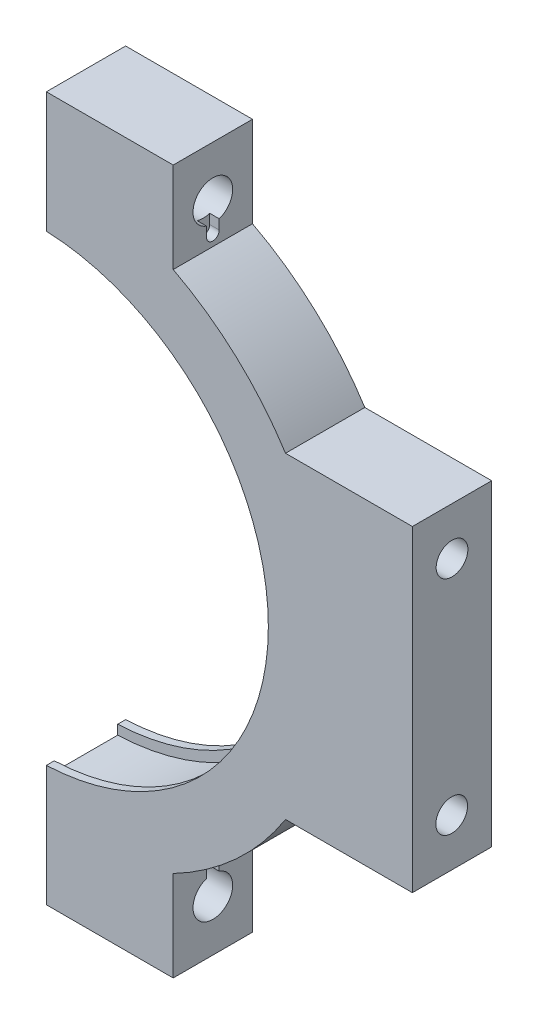
ISO-10303-21;
HEADER;
FILE_DESCRIPTION(('STEP AP214'),'2;1');
FILE_NAME('part.step','',(''),(''),'','','');
FILE_SCHEMA(('AUTOMOTIVE_DESIGN { 1 0 10303 214 1 1 1 1 }'));
ENDSEC;
DATA;
#1=APPLICATION_CONTEXT('core data for automotive mechanical design processes');
#2=APPLICATION_PROTOCOL_DEFINITION('international standard','automotive_design',2000,#1);
#3=PRODUCT_CONTEXT('',#1,'mechanical');
#4=PRODUCT('Part','Part','',(#3));
#5=PRODUCT_RELATED_PRODUCT_CATEGORY('part','',(#4));
#6=PRODUCT_DEFINITION_FORMATION('','',#4);
#7=PRODUCT_DEFINITION_CONTEXT('part definition',#1,'design');
#8=PRODUCT_DEFINITION('design','',#6,#7);
#9=PRODUCT_DEFINITION_SHAPE('','',#8);
#10=(LENGTH_UNIT() NAMED_UNIT(*) SI_UNIT(.MILLI.,.METRE.));
#11=(NAMED_UNIT(*) PLANE_ANGLE_UNIT() SI_UNIT($,.RADIAN.));
#12=(NAMED_UNIT(*) SI_UNIT($,.STERADIAN.) SOLID_ANGLE_UNIT());
#13=UNCERTAINTY_MEASURE_WITH_UNIT(LENGTH_MEASURE(1.E-05),#10,'distance_accuracy_value','');
#14=(GEOMETRIC_REPRESENTATION_CONTEXT(3) GLOBAL_UNCERTAINTY_ASSIGNED_CONTEXT((#13)) GLOBAL_UNIT_ASSIGNED_CONTEXT((#10,
#11,#12)) REPRESENTATION_CONTEXT('',''));
#15=CARTESIAN_POINT('',(0.,0.,0.));
#16=DIRECTION('',(0.,0.,1.));
#17=DIRECTION('',(1.,0.,0.));
#18=AXIS2_PLACEMENT_3D('',#15,#16,#17);
#19=CARTESIAN_POINT('',(0.,0.,25.));
#20=DIRECTION('',(0.,0.,-1.));
#21=DIRECTION('',(-1.,0.,0.));
#22=AXIS2_PLACEMENT_3D('',#19,#20,#21);
#23=CYLINDRICAL_SURFACE('',#22,73.);
#24=DIRECTION('',(0.,0.,-1.));
#25=VECTOR('',#24,1.);
#26=CARTESIAN_POINT('',(3.00000000000001,-72.9383301152419,25.));
#27=LINE('',#26,#25);
#28=CARTESIAN_POINT('',(3.00000000000001,-72.9383301152419,2.5));
#29=VERTEX_POINT('',#28);
#30=CARTESIAN_POINT('',(3.00000000000001,-72.9383301152419,0.));
#31=VERTEX_POINT('',#30);
#32=EDGE_CURVE('E476',#29,#31,#27,.T.);
#33=ORIENTED_EDGE('',*,*,#32,.F.);
#34=CARTESIAN_POINT('',(0.,0.,2.5));
#35=DIRECTION('',(0.,0.,1.));
#36=DIRECTION('',(1.,0.,0.));
#37=AXIS2_PLACEMENT_3D('',#34,#35,#36);
#38=CIRCLE('',#37,73.);
#39=CARTESIAN_POINT('',(2.99999999999999,72.9383301152419,2.5));
#40=VERTEX_POINT('',#39);
#41=EDGE_CURVE('E61',#29,#40,#38,.T.);
#42=ORIENTED_EDGE('',*,*,#41,.T.);
#43=DIRECTION('',(0.,0.,-1.));
#44=VECTOR('',#43,1.);
#45=CARTESIAN_POINT('',(2.99999999999999,72.9383301152419,25.));
#46=LINE('',#45,#44);
#47=CARTESIAN_POINT('',(2.99999999999999,72.9383301152419,0.));
#48=VERTEX_POINT('',#47);
#49=EDGE_CURVE('E479',#40,#48,#46,.T.);
#50=ORIENTED_EDGE('',*,*,#49,.T.);
#51=CARTESIAN_POINT('',(0.,0.,0.));
#52=DIRECTION('',(0.,0.,1.));
#53=DIRECTION('',(1.,0.,0.));
#54=AXIS2_PLACEMENT_3D('',#51,#52,#53);
#55=CIRCLE('',#54,73.);
#56=EDGE_CURVE('E432',#31,#48,#55,.T.);
#57=ORIENTED_EDGE('',*,*,#56,.F.);
#58=EDGE_LOOP('',(#33,#42,#50,#57));
#59=FACE_BOUND('',#58,.T.);
#60=ADVANCED_FACE('F45',(#59),#23,.F.);
#61=CARTESIAN_POINT('',(43.,0.,25.));
#62=DIRECTION('',(1.,0.,0.));
#63=DIRECTION('',(0.,1.,0.));
#64=AXIS2_PLACEMENT_3D('',#61,#62,#63);
#65=PLANE('',#64);
#66=DIRECTION('',(0.,-1.,0.));
#67=VECTOR('',#66,1.);
#68=CARTESIAN_POINT('',(43.,0.,0.));
#69=LINE('',#68,#67);
#70=CARTESIAN_POINT('',(43.,111.,0.));
#71=VERTEX_POINT('',#70);
#72=CARTESIAN_POINT('',(43.,82.4621125123532,0.));
#73=VERTEX_POINT('',#72);
#74=EDGE_CURVE('E420',#71,#73,#69,.T.);
#75=ORIENTED_EDGE('',*,*,#74,.F.);
#76=DIRECTION('',(0.,0.,-1.));
#77=VECTOR('',#76,1.);
#78=CARTESIAN_POINT('',(43.,111.,25.));
#79=LINE('',#78,#77);
#80=CARTESIAN_POINT('',(43.,111.,25.));
#81=VERTEX_POINT('',#80);
#82=EDGE_CURVE('E487',#81,#71,#79,.T.);
#83=ORIENTED_EDGE('',*,*,#82,.F.);
#84=DIRECTION('',(0.,-1.,0.));
#85=VECTOR('',#84,1.);
#86=CARTESIAN_POINT('',(43.,0.,25.));
#87=LINE('',#86,#85);
#88=CARTESIAN_POINT('',(43.,82.4621125123532,25.));
#89=VERTEX_POINT('',#88);
#90=EDGE_CURVE('E377',#81,#89,#87,.T.);
#91=ORIENTED_EDGE('',*,*,#90,.T.);
#92=DIRECTION('',(0.,0.,-1.));
#93=VECTOR('',#92,1.);
#94=CARTESIAN_POINT('',(43.,82.4621125123532,25.));
#95=LINE('',#94,#93);
#96=EDGE_CURVE('E54',#89,#73,#95,.T.);
#97=ORIENTED_EDGE('',*,*,#96,.T.);
#98=EDGE_LOOP('',(#75,#83,#91,#97));
#99=FACE_BOUND('',#98,.T.);
#100=CARTESIAN_POINT('',(43.0000000000001,86.,12.5));
#101=DIRECTION('',(1.,0.,0.));
#102=DIRECTION('',(0.,1.,0.));
#103=AXIS2_PLACEMENT_3D('',#100,#101,#102);
#104=CIRCLE('',#103,2.);
#105=CARTESIAN_POINT('',(43.0000000000001,86.,14.5));
#106=VERTEX_POINT('',#105);
#107=CARTESIAN_POINT('',(43.0000000000001,86.,10.5));
#108=VERTEX_POINT('',#107);
#109=EDGE_CURVE('E282',#106,#108,#104,.T.);
#110=ORIENTED_EDGE('',*,*,#109,.F.);
#111=DIRECTION('',(0.,1.,0.));
#112=VECTOR('',#111,1.);
#113=CARTESIAN_POINT('',(43.,0.,14.5));
#114=LINE('',#113,#112);
#115=CARTESIAN_POINT('',(43.0000000000001,89.0786403588365,14.5));
#116=VERTEX_POINT('',#115);
#117=EDGE_CURVE('E278',#106,#116,#114,.T.);
#118=ORIENTED_EDGE('',*,*,#117,.T.);
#119=CARTESIAN_POINT('',(43.0000000000001,95.,12.5));
#120=DIRECTION('',(1.,0.,0.));
#121=DIRECTION('',(0.,1.,0.));
#122=AXIS2_PLACEMENT_3D('',#119,#120,#121);
#123=CIRCLE('',#122,6.25000000000001);
#124=CARTESIAN_POINT('',(43.0000000000001,89.0786403588365,10.5));
#125=VERTEX_POINT('',#124);
#126=EDGE_CURVE('E342',#125,#116,#123,.T.);
#127=ORIENTED_EDGE('',*,*,#126,.F.);
#128=DIRECTION('',(0.,1.,0.));
#129=VECTOR('',#128,1.);
#130=CARTESIAN_POINT('',(43.,0.,10.5));
#131=LINE('',#130,#129);
#132=EDGE_CURVE('E266',#108,#125,#131,.T.);
#133=ORIENTED_EDGE('',*,*,#132,.F.);
#134=EDGE_LOOP('',(#110,#118,#127,#133));
#135=FACE_BOUND('',#134,.T.);
#136=ADVANCED_FACE('F493',(#99,#135),#65,.T.);
#137=CARTESIAN_POINT('',(43.,0.,25.));
#138=DIRECTION('',(-1.,0.,0.));
#139=DIRECTION('',(0.,0.,1.));
#140=AXIS2_PLACEMENT_3D('',#137,#138,#139);
#141=PLANE('',#140);
#142=DIRECTION('',(0.,1.,0.));
#143=VECTOR('',#142,1.);
#144=CARTESIAN_POINT('',(43.,0.,0.));
#145=LINE('',#144,#143);
#146=CARTESIAN_POINT('',(43.,-111.,0.));
#147=VERTEX_POINT('',#146);
#148=CARTESIAN_POINT('',(43.,-82.4621125123532,0.));
#149=VERTEX_POINT('',#148);
#150=EDGE_CURVE('E442',#147,#149,#145,.T.);
#151=ORIENTED_EDGE('',*,*,#150,.T.);
#152=DIRECTION('',(0.,0.,-1.));
#153=VECTOR('',#152,1.);
#154=CARTESIAN_POINT('',(43.,-82.4621125123532,25.));
#155=LINE('',#154,#153);
#156=CARTESIAN_POINT('',(43.,-82.4621125123532,25.));
#157=VERTEX_POINT('',#156);
#158=EDGE_CURVE('E464',#157,#149,#155,.T.);
#159=ORIENTED_EDGE('',*,*,#158,.F.);
#160=DIRECTION('',(0.,1.,0.));
#161=VECTOR('',#160,1.);
#162=CARTESIAN_POINT('',(43.,0.,25.));
#163=LINE('',#162,#161);
#164=CARTESIAN_POINT('',(43.,-111.,25.));
#165=VERTEX_POINT('',#164);
#166=EDGE_CURVE('E399',#165,#157,#163,.T.);
#167=ORIENTED_EDGE('',*,*,#166,.F.);
#168=DIRECTION('',(0.,0.,-1.));
#169=VECTOR('',#168,1.);
#170=CARTESIAN_POINT('',(43.,-111.,25.));
#171=LINE('',#170,#169);
#172=EDGE_CURVE('E468',#165,#147,#171,.T.);
#173=ORIENTED_EDGE('',*,*,#172,.T.);
#174=EDGE_LOOP('',(#151,#159,#167,#173));
#175=FACE_BOUND('',#174,.T.);
#176=DIRECTION('',(0.,-1.,0.));
#177=VECTOR('',#176,1.);
#178=CARTESIAN_POINT('',(43.,0.,10.5));
#179=LINE('',#178,#177);
#180=CARTESIAN_POINT('',(43.,-86.,10.5));
#181=VERTEX_POINT('',#180);
#182=CARTESIAN_POINT('',(43.,-89.0786403588365,10.5));
#183=VERTEX_POINT('',#182);
#184=EDGE_CURVE('E306',#181,#183,#179,.T.);
#185=ORIENTED_EDGE('',*,*,#184,.T.);
#186=CARTESIAN_POINT('',(43.,-95.,12.5));
#187=DIRECTION('',(1.,0.,0.));
#188=DIRECTION('',(0.,1.,0.));
#189=AXIS2_PLACEMENT_3D('',#186,#187,#188);
#190=CIRCLE('',#189,6.25000000000001);
#191=CARTESIAN_POINT('',(43.,-89.0786403588365,14.5));
#192=VERTEX_POINT('',#191);
#193=EDGE_CURVE('E292',#183,#192,#190,.F.);
#194=ORIENTED_EDGE('',*,*,#193,.T.);
#195=DIRECTION('',(0.,-1.,0.));
#196=VECTOR('',#195,1.);
#197=CARTESIAN_POINT('',(43.,0.,14.5));
#198=LINE('',#197,#196);
#199=CARTESIAN_POINT('',(43.,-86.,14.5));
#200=VERTEX_POINT('',#199);
#201=EDGE_CURVE('E319',#200,#192,#198,.T.);
#202=ORIENTED_EDGE('',*,*,#201,.F.);
#203=CARTESIAN_POINT('',(43.,-86.,12.5));
#204=DIRECTION('',(1.,0.,0.));
#205=DIRECTION('',(0.,1.,0.));
#206=AXIS2_PLACEMENT_3D('',#203,#204,#205);
#207=CIRCLE('',#206,2.);
#208=EDGE_CURVE('E233',#200,#181,#207,.F.);
#209=ORIENTED_EDGE('',*,*,#208,.T.);
#210=EDGE_LOOP('',(#185,#194,#202,#209));
#211=FACE_BOUND('',#210,.T.);
#212=ADVANCED_FACE('F532',(#175,#211),#141,.F.);
#213=CARTESIAN_POINT('',(2.99999999999988,-95.,12.5));
#214=DIRECTION('',(1.,0.,0.));
#215=DIRECTION('',(0.,1.,0.));
#216=AXIS2_PLACEMENT_3D('',#213,#214,#215);
#217=CYLINDRICAL_SURFACE('',#216,6.25000000000001);
#218=CARTESIAN_POINT('',(2.99999999999988,-95.,12.5));
#219=DIRECTION('',(1.,0.,0.));
#220=DIRECTION('',(0.,1.,0.));
#221=AXIS2_PLACEMENT_3D('',#218,#219,#220);
#222=CIRCLE('',#221,6.25000000000001);
#223=CARTESIAN_POINT('',(2.99999999999989,-88.75,12.5));
#224=VERTEX_POINT('',#223);
#225=EDGE_CURVE('E346',#224,#224,#222,.F.);
#226=ORIENTED_EDGE('',*,*,#225,.T.);
#227=EDGE_LOOP('',(#226));
#228=FACE_BOUND('',#227,.T.);
#229=ORIENTED_EDGE('',*,*,#193,.F.);
#230=DIRECTION('',(1.,0.,0.));
#231=VECTOR('',#230,1.);
#232=CARTESIAN_POINT('',(40.,-89.0786403588365,10.5));
#233=LINE('',#232,#231);
#234=CARTESIAN_POINT('',(40.,-89.0786403588365,10.5));
#235=VERTEX_POINT('',#234);
#236=EDGE_CURVE('E328',#235,#183,#233,.T.);
#237=ORIENTED_EDGE('',*,*,#236,.F.);
#238=CARTESIAN_POINT('',(40.,-95.,12.5));
#239=DIRECTION('',(1.,0.,0.));
#240=DIRECTION('',(0.,1.,0.));
#241=AXIS2_PLACEMENT_3D('',#238,#239,#240);
#242=CIRCLE('',#241,6.25000000000001);
#243=CARTESIAN_POINT('',(40.,-89.0786403588365,14.5));
#244=VERTEX_POINT('',#243);
#245=EDGE_CURVE('E309',#244,#235,#242,.F.);
#246=ORIENTED_EDGE('',*,*,#245,.F.);
#247=DIRECTION('',(1.,0.,0.));
#248=VECTOR('',#247,1.);
#249=CARTESIAN_POINT('',(40.,-89.0786403588365,14.5));
#250=LINE('',#249,#248);
#251=EDGE_CURVE('E331',#244,#192,#250,.T.);
#252=ORIENTED_EDGE('',*,*,#251,.T.);
#253=EDGE_LOOP('',(#229,#237,#246,#252));
#254=FACE_BOUND('',#253,.T.);
#255=ADVANCED_FACE('F586',(#228,#254),#217,.F.);
#256=CARTESIAN_POINT('',(2.99999999999998,95.,12.5));
#257=DIRECTION('',(1.,0.,0.));
#258=DIRECTION('',(0.,1.,0.));
#259=AXIS2_PLACEMENT_3D('',#256,#257,#258);
#260=CYLINDRICAL_SURFACE('',#259,6.25000000000001);
#261=CARTESIAN_POINT('',(2.99999999999998,95.,12.5));
#262=DIRECTION('',(1.,0.,0.));
#263=DIRECTION('',(0.,1.,0.));
#264=AXIS2_PLACEMENT_3D('',#261,#262,#263);
#265=CIRCLE('',#264,6.25000000000001);
#266=CARTESIAN_POINT('',(2.99999999999998,101.25,12.5));
#267=VERTEX_POINT('',#266);
#268=EDGE_CURVE('E337',#267,#267,#265,.T.);
#269=ORIENTED_EDGE('',*,*,#268,.F.);
#270=EDGE_LOOP('',(#269));
#271=FACE_BOUND('',#270,.T.);
#272=DIRECTION('',(1.,0.,0.));
#273=VECTOR('',#272,1.);
#274=CARTESIAN_POINT('',(40.0000000000001,89.0786403588365,14.5));
#275=LINE('',#274,#273);
#276=CARTESIAN_POINT('',(40.0000000000001,89.0786403588365,14.5));
#277=VERTEX_POINT('',#276);
#278=EDGE_CURVE('E289',#277,#116,#275,.T.);
#279=ORIENTED_EDGE('',*,*,#278,.F.);
#280=CARTESIAN_POINT('',(40.0000000000001,95.,12.5));
#281=DIRECTION('',(1.,0.,0.));
#282=DIRECTION('',(0.,1.,0.));
#283=AXIS2_PLACEMENT_3D('',#280,#281,#282);
#284=CIRCLE('',#283,6.25000000000001);
#285=CARTESIAN_POINT('',(40.0000000000001,89.0786403588365,10.5));
#286=VERTEX_POINT('',#285);
#287=EDGE_CURVE('E273',#277,#286,#284,.T.);
#288=ORIENTED_EDGE('',*,*,#287,.T.);
#289=DIRECTION('',(1.,0.,0.));
#290=VECTOR('',#289,1.);
#291=CARTESIAN_POINT('',(40.0000000000001,89.0786403588365,10.5));
#292=LINE('',#291,#290);
#293=EDGE_CURVE('E293',#286,#125,#292,.T.);
#294=ORIENTED_EDGE('',*,*,#293,.T.);
#295=ORIENTED_EDGE('',*,*,#126,.T.);
#296=EDGE_LOOP('',(#279,#288,#294,#295));
#297=FACE_BOUND('',#296,.T.);
#298=ADVANCED_FACE('F582',(#271,#297),#260,.F.);
#299=CARTESIAN_POINT('',(0.,50.,25.));
#300=DIRECTION('',(0.,1.,0.));
#301=DIRECTION('',(-1.,0.,0.));
#302=AXIS2_PLACEMENT_3D('',#299,#300,#301);
#303=PLANE('',#302);
#304=DIRECTION('',(1.,0.,0.));
#305=VECTOR('',#304,1.);
#306=CARTESIAN_POINT('',(0.,50.,0.));
#307=LINE('',#306,#305);
#308=CARTESIAN_POINT('',(78.4155596804614,50.,0.));
#309=VERTEX_POINT('',#308);
#310=CARTESIAN_POINT('',(118.415559680461,50.,0.));
#311=VERTEX_POINT('',#310);
#312=EDGE_CURVE('E368',#309,#311,#307,.T.);
#313=ORIENTED_EDGE('',*,*,#312,.F.);
#314=DIRECTION('',(0.,0.,-1.));
#315=VECTOR('',#314,1.);
#316=CARTESIAN_POINT('',(78.4155596804614,50.,25.));
#317=LINE('',#316,#315);
#318=CARTESIAN_POINT('',(78.4155596804614,50.,25.));
#319=VERTEX_POINT('',#318);
#320=EDGE_CURVE('E11',#319,#309,#317,.T.);
#321=ORIENTED_EDGE('',*,*,#320,.F.);
#322=DIRECTION('',(1.,0.,0.));
#323=VECTOR('',#322,1.);
#324=CARTESIAN_POINT('',(0.,50.,25.));
#325=LINE('',#324,#323);
#326=CARTESIAN_POINT('',(118.415559680461,50.,25.));
#327=VERTEX_POINT('',#326);
#328=EDGE_CURVE('E369',#319,#327,#325,.T.);
#329=ORIENTED_EDGE('',*,*,#328,.T.);
#330=DIRECTION('',(0.,0.,-1.));
#331=VECTOR('',#330,1.);
#332=CARTESIAN_POINT('',(118.415559680461,50.,25.));
#333=LINE('',#332,#331);
#334=EDGE_CURVE('E412',#327,#311,#333,.T.);
#335=ORIENTED_EDGE('',*,*,#334,.T.);
#336=EDGE_LOOP('',(#313,#321,#329,#335));
#337=FACE_BOUND('',#336,.T.);
#338=ADVANCED_FACE('F47',(#337),#303,.T.);
#339=CARTESIAN_POINT('',(0.,0.,25.));
#340=DIRECTION('',(0.,0.,-1.));
#341=DIRECTION('',(-1.,0.,0.));
#342=AXIS2_PLACEMENT_3D('',#339,#340,#341);
#343=CYLINDRICAL_SURFACE('',#342,93.);
#344=CARTESIAN_POINT('',(0.,0.,0.));
#345=DIRECTION('',(0.,0.,1.));
#346=DIRECTION('',(1.,0.,0.));
#347=AXIS2_PLACEMENT_3D('',#344,#345,#346);
#348=CIRCLE('',#347,93.);
#349=EDGE_CURVE('E416',#309,#73,#348,.T.);
#350=ORIENTED_EDGE('',*,*,#349,.T.);
#351=ORIENTED_EDGE('',*,*,#96,.F.);
#352=CARTESIAN_POINT('',(0.,0.,25.));
#353=DIRECTION('',(0.,0.,1.));
#354=DIRECTION('',(1.,0.,0.));
#355=AXIS2_PLACEMENT_3D('',#352,#353,#354);
#356=CIRCLE('',#355,93.);
#357=EDGE_CURVE('E373',#319,#89,#356,.T.);
#358=ORIENTED_EDGE('',*,*,#357,.F.);
#359=ORIENTED_EDGE('',*,*,#320,.T.);
#360=EDGE_LOOP('',(#350,#351,#358,#359));
#361=FACE_BOUND('',#360,.T.);
#362=ADVANCED_FACE('F499',(#361),#343,.T.);
#363=CARTESIAN_POINT('',(0.,111.,25.));
#364=DIRECTION('',(0.,1.,0.));
#365=DIRECTION('',(-1.,0.,0.));
#366=AXIS2_PLACEMENT_3D('',#363,#364,#365);
#367=PLANE('',#366);
#368=DIRECTION('',(1.,0.,0.));
#369=VECTOR('',#368,1.);
#370=CARTESIAN_POINT('',(0.,111.,0.));
#371=LINE('',#370,#369);
#372=CARTESIAN_POINT('',(2.99999999999999,111.,0.));
#373=VERTEX_POINT('',#372);
#374=EDGE_CURVE('E424',#373,#71,#371,.T.);
#375=ORIENTED_EDGE('',*,*,#374,.F.);
#376=DIRECTION('',(0.,0.,-1.));
#377=VECTOR('',#376,1.);
#378=CARTESIAN_POINT('',(2.99999999999999,111.,25.));
#379=LINE('',#378,#377);
#380=CARTESIAN_POINT('',(2.99999999999999,111.,25.));
#381=VERTEX_POINT('',#380);
#382=EDGE_CURVE('E484',#381,#373,#379,.T.);
#383=ORIENTED_EDGE('',*,*,#382,.F.);
#384=DIRECTION('',(1.,0.,0.));
#385=VECTOR('',#384,1.);
#386=CARTESIAN_POINT('',(0.,111.,25.));
#387=LINE('',#386,#385);
#388=EDGE_CURVE('E381',#381,#81,#387,.T.);
#389=ORIENTED_EDGE('',*,*,#388,.T.);
#390=ORIENTED_EDGE('',*,*,#82,.T.);
#391=EDGE_LOOP('',(#375,#383,#389,#390));
#392=FACE_BOUND('',#391,.T.);
#393=ADVANCED_FACE('F506',(#392),#367,.T.);
#394=CARTESIAN_POINT('',(3.,0.,25.));
#395=DIRECTION('',(-1.,0.,0.));
#396=DIRECTION('',(0.,-1.,0.));
#397=AXIS2_PLACEMENT_3D('',#394,#395,#396);
#398=PLANE('',#397);
#399=DIRECTION('',(0.,1.,0.));
#400=VECTOR('',#399,1.);
#401=CARTESIAN_POINT('',(3.,0.,22.5));
#402=LINE('',#401,#400);
#403=CARTESIAN_POINT('',(2.99999999999999,72.9383301152419,22.5));
#404=VERTEX_POINT('',#403);
#405=CARTESIAN_POINT('',(2.99999999999999,75.9407663906548,22.5));
#406=VERTEX_POINT('',#405);
#407=EDGE_CURVE('E221',#404,#406,#402,.T.);
#408=ORIENTED_EDGE('',*,*,#407,.F.);
#409=CARTESIAN_POINT('',(2.99999999999999,72.9383301152419,25.));
#410=VERTEX_POINT('',#409);
#411=EDGE_CURVE('E480',#410,#404,#46,.T.);
#412=ORIENTED_EDGE('',*,*,#411,.F.);
#413=DIRECTION('',(0.,1.,0.));
#414=VECTOR('',#413,1.);
#415=CARTESIAN_POINT('',(3.,0.,25.));
#416=LINE('',#415,#414);
#417=EDGE_CURVE('E385',#410,#381,#416,.T.);
#418=ORIENTED_EDGE('',*,*,#417,.T.);
#419=ORIENTED_EDGE('',*,*,#382,.T.);
#420=DIRECTION('',(0.,1.,0.));
#421=VECTOR('',#420,1.);
#422=CARTESIAN_POINT('',(3.,0.,0.));
#423=LINE('',#422,#421);
#424=EDGE_CURVE('E428',#48,#373,#423,.T.);
#425=ORIENTED_EDGE('',*,*,#424,.F.);
#426=ORIENTED_EDGE('',*,*,#49,.F.);
#427=DIRECTION('',(0.,1.,0.));
#428=VECTOR('',#427,1.);
#429=CARTESIAN_POINT('',(3.,0.,2.5));
#430=LINE('',#429,#428);
#431=CARTESIAN_POINT('',(2.99999999999999,75.9407663906548,2.5));
#432=VERTEX_POINT('',#431);
#433=EDGE_CURVE('E243',#40,#432,#430,.T.);
#434=ORIENTED_EDGE('',*,*,#433,.T.);
#435=DIRECTION('',(0.,0.,-1.));
#436=VECTOR('',#435,1.);
#437=CARTESIAN_POINT('',(2.99999999999999,75.9407663906548,22.5));
#438=LINE('',#437,#436);
#439=EDGE_CURVE('E234',#406,#432,#438,.T.);
#440=ORIENTED_EDGE('',*,*,#439,.F.);
#441=EDGE_LOOP('',(#408,#412,#418,#419,#425,#426,#434,#440));
#442=FACE_BOUND('',#441,.T.);
#443=ORIENTED_EDGE('',*,*,#268,.T.);
#444=EDGE_LOOP('',(#443));
#445=FACE_BOUND('',#444,.T.);
#446=ADVANCED_FACE('F546',(#442,#445),#398,.T.);
#447=CARTESIAN_POINT('',(0.,0.,22.5));
#448=DIRECTION('',(0.,0.,1.));
#449=DIRECTION('',(1.,0.,0.));
#450=AXIS2_PLACEMENT_3D('',#447,#448,#449);
#451=CIRCLE('',#450,73.);
#452=CARTESIAN_POINT('',(3.00000000000001,-72.9383301152419,22.5));
#453=VERTEX_POINT('',#452);
#454=EDGE_CURVE('E248',#453,#404,#451,.T.);
#455=ORIENTED_EDGE('',*,*,#454,.F.);
#456=CARTESIAN_POINT('',(3.00000000000001,-72.9383301152419,25.));
#457=VERTEX_POINT('',#456);
#458=EDGE_CURVE('E239',#457,#453,#27,.T.);
#459=ORIENTED_EDGE('',*,*,#458,.F.);
#460=CARTESIAN_POINT('',(0.,0.,25.));
#461=DIRECTION('',(0.,0.,1.));
#462=DIRECTION('',(1.,0.,0.));
#463=AXIS2_PLACEMENT_3D('',#460,#461,#462);
#464=CIRCLE('',#463,73.);
#465=EDGE_CURVE('E389',#457,#410,#464,.T.);
#466=ORIENTED_EDGE('',*,*,#465,.T.);
#467=ORIENTED_EDGE('',*,*,#411,.T.);
#468=EDGE_LOOP('',(#455,#459,#466,#467));
#469=FACE_BOUND('',#468,.T.);
#470=ADVANCED_FACE('F550',(#469),#23,.F.);
#471=CARTESIAN_POINT('',(3.,0.,25.));
#472=DIRECTION('',(1.,0.,0.));
#473=DIRECTION('',(0.,1.,0.));
#474=AXIS2_PLACEMENT_3D('',#471,#472,#473);
#475=PLANE('',#474);
#476=ORIENTED_EDGE('',*,*,#225,.F.);
#477=EDGE_LOOP('',(#476));
#478=FACE_BOUND('',#477,.T.);
#479=ORIENTED_EDGE('',*,*,#458,.T.);
#480=DIRECTION('',(0.,-1.,0.));
#481=VECTOR('',#480,1.);
#482=CARTESIAN_POINT('',(3.,0.,22.5));
#483=LINE('',#482,#481);
#484=CARTESIAN_POINT('',(3.00000000000001,-75.9407663906548,22.5));
#485=VERTEX_POINT('',#484);
#486=EDGE_CURVE('E218',#453,#485,#483,.T.);
#487=ORIENTED_EDGE('',*,*,#486,.T.);
#488=DIRECTION('',(0.,0.,-1.));
#489=VECTOR('',#488,1.);
#490=CARTESIAN_POINT('',(3.00000000000001,-75.9407663906548,22.5));
#491=LINE('',#490,#489);
#492=CARTESIAN_POINT('',(3.00000000000001,-75.9407663906548,2.5));
#493=VERTEX_POINT('',#492);
#494=EDGE_CURVE('E227',#485,#493,#491,.T.);
#495=ORIENTED_EDGE('',*,*,#494,.T.);
#496=DIRECTION('',(0.,-1.,0.));
#497=VECTOR('',#496,1.);
#498=CARTESIAN_POINT('',(3.,0.,2.5));
#499=LINE('',#498,#497);
#500=EDGE_CURVE('E251',#29,#493,#499,.T.);
#501=ORIENTED_EDGE('',*,*,#500,.F.);
#502=ORIENTED_EDGE('',*,*,#32,.T.);
#503=DIRECTION('',(0.,-1.,0.));
#504=VECTOR('',#503,1.);
#505=CARTESIAN_POINT('',(3.,0.,0.));
#506=LINE('',#505,#504);
#507=CARTESIAN_POINT('',(3.00000000000001,-111.,0.));
#508=VERTEX_POINT('',#507);
#509=EDGE_CURVE('E436',#31,#508,#506,.T.);
#510=ORIENTED_EDGE('',*,*,#509,.T.);
#511=DIRECTION('',(0.,0.,-1.));
#512=VECTOR('',#511,1.);
#513=CARTESIAN_POINT('',(3.00000000000001,-111.,25.));
#514=LINE('',#513,#512);
#515=CARTESIAN_POINT('',(3.00000000000001,-111.,25.));
#516=VERTEX_POINT('',#515);
#517=EDGE_CURVE('E472',#516,#508,#514,.T.);
#518=ORIENTED_EDGE('',*,*,#517,.F.);
#519=DIRECTION('',(0.,-1.,0.));
#520=VECTOR('',#519,1.);
#521=CARTESIAN_POINT('',(3.,0.,25.));
#522=LINE('',#521,#520);
#523=EDGE_CURVE('E393',#457,#516,#522,.T.);
#524=ORIENTED_EDGE('',*,*,#523,.F.);
#525=EDGE_LOOP('',(#479,#487,#495,#501,#502,#510,#518,#524));
#526=FACE_BOUND('',#525,.T.);
#527=ADVANCED_FACE('F237',(#478,#526),#475,.F.);
#528=CARTESIAN_POINT('',(0.,-111.,25.));
#529=DIRECTION('',(0.,1.,0.));
#530=DIRECTION('',(-1.,0.,0.));
#531=AXIS2_PLACEMENT_3D('',#528,#529,#530);
#532=PLANE('',#531);
#533=DIRECTION('',(1.,0.,0.));
#534=VECTOR('',#533,1.);
#535=CARTESIAN_POINT('',(0.,-111.,0.));
#536=LINE('',#535,#534);
#537=EDGE_CURVE('E439',#508,#147,#536,.T.);
#538=ORIENTED_EDGE('',*,*,#537,.T.);
#539=ORIENTED_EDGE('',*,*,#172,.F.);
#540=DIRECTION('',(1.,0.,0.));
#541=VECTOR('',#540,1.);
#542=CARTESIAN_POINT('',(0.,-111.,25.));
#543=LINE('',#542,#541);
#544=EDGE_CURVE('E396',#516,#165,#543,.T.);
#545=ORIENTED_EDGE('',*,*,#544,.F.);
#546=ORIENTED_EDGE('',*,*,#517,.T.);
#547=EDGE_LOOP('',(#538,#539,#545,#546));
#548=FACE_BOUND('',#547,.T.);
#549=ADVANCED_FACE('F537',(#548),#532,.F.);
#550=CARTESIAN_POINT('',(0.,0.,25.));
#551=DIRECTION('',(0.,0.,-1.));
#552=DIRECTION('',(-1.,0.,0.));
#553=AXIS2_PLACEMENT_3D('',#550,#551,#552);
#554=CYLINDRICAL_SURFACE('',#553,93.);
#555=CARTESIAN_POINT('',(0.,0.,0.));
#556=DIRECTION('',(0.,0.,1.));
#557=DIRECTION('',(1.,0.,0.));
#558=AXIS2_PLACEMENT_3D('',#555,#556,#557);
#559=CIRCLE('',#558,93.);
#560=CARTESIAN_POINT('',(78.4155596804614,-50.,0.));
#561=VERTEX_POINT('',#560);
#562=EDGE_CURVE('E445',#149,#561,#559,.T.);
#563=ORIENTED_EDGE('',*,*,#562,.T.);
#564=DIRECTION('',(0.,0.,-1.));
#565=VECTOR('',#564,1.);
#566=CARTESIAN_POINT('',(78.4155596804614,-50.,25.));
#567=LINE('',#566,#565);
#568=CARTESIAN_POINT('',(78.4155596804614,-50.,25.));
#569=VERTEX_POINT('',#568);
#570=EDGE_CURVE('E460',#569,#561,#567,.T.);
#571=ORIENTED_EDGE('',*,*,#570,.F.);
#572=CARTESIAN_POINT('',(0.,0.,25.));
#573=DIRECTION('',(0.,0.,1.));
#574=DIRECTION('',(1.,0.,0.));
#575=AXIS2_PLACEMENT_3D('',#572,#573,#574);
#576=CIRCLE('',#575,93.);
#577=EDGE_CURVE('E402',#157,#569,#576,.T.);
#578=ORIENTED_EDGE('',*,*,#577,.F.);
#579=ORIENTED_EDGE('',*,*,#158,.T.);
#580=EDGE_LOOP('',(#563,#571,#578,#579));
#581=FACE_BOUND('',#580,.T.);
#582=ADVANCED_FACE('F527',(#581),#554,.T.);
#583=CARTESIAN_POINT('',(0.,-50.,25.));
#584=DIRECTION('',(0.,1.,0.));
#585=DIRECTION('',(-1.,0.,0.));
#586=AXIS2_PLACEMENT_3D('',#583,#584,#585);
#587=PLANE('',#586);
#588=DIRECTION('',(1.,0.,0.));
#589=VECTOR('',#588,1.);
#590=CARTESIAN_POINT('',(0.,-50.,0.));
#591=LINE('',#590,#589);
#592=CARTESIAN_POINT('',(118.415559680461,-50.,0.));
#593=VERTEX_POINT('',#592);
#594=EDGE_CURVE('E448',#561,#593,#591,.T.);
#595=ORIENTED_EDGE('',*,*,#594,.T.);
#596=DIRECTION('',(0.,0.,-1.));
#597=VECTOR('',#596,1.);
#598=CARTESIAN_POINT('',(118.415559680461,-50.,25.));
#599=LINE('',#598,#597);
#600=CARTESIAN_POINT('',(118.415559680461,-50.,25.));
#601=VERTEX_POINT('',#600);
#602=EDGE_CURVE('E457',#601,#593,#599,.T.);
#603=ORIENTED_EDGE('',*,*,#602,.F.);
#604=DIRECTION('',(1.,0.,0.));
#605=VECTOR('',#604,1.);
#606=CARTESIAN_POINT('',(0.,-50.,25.));
#607=LINE('',#606,#605);
#608=EDGE_CURVE('E405',#569,#601,#607,.T.);
#609=ORIENTED_EDGE('',*,*,#608,.F.);
#610=ORIENTED_EDGE('',*,*,#570,.T.);
#611=EDGE_LOOP('',(#595,#603,#609,#610));
#612=FACE_BOUND('',#611,.T.);
#613=ADVANCED_FACE('F521',(#612),#587,.F.);
#614=CARTESIAN_POINT('',(118.415559680461,0.,25.));
#615=DIRECTION('',(1.,0.,0.));
#616=DIRECTION('',(0.,1.,0.));
#617=AXIS2_PLACEMENT_3D('',#614,#615,#616);
#618=PLANE('',#617);
#619=CARTESIAN_POINT('',(118.415559680461,35.,12.5));
#620=DIRECTION('',(1.,0.,0.));
#621=DIRECTION('',(0.,0.,-1.));
#622=AXIS2_PLACEMENT_3D('',#619,#620,#621);
#623=CIRCLE('',#622,5.);
#624=CARTESIAN_POINT('',(118.415559680461,35.,7.5));
#625=VERTEX_POINT('',#624);
#626=EDGE_CURVE('E341',#625,#625,#623,.T.);
#627=ORIENTED_EDGE('',*,*,#626,.F.);
#628=EDGE_LOOP('',(#627));
#629=FACE_BOUND('',#628,.T.);
#630=CARTESIAN_POINT('',(118.415559680461,-34.9999280391702,12.6003718635349));
#631=DIRECTION('',(1.,0.,0.));
#632=DIRECTION('',(0.,0.,-1.));
#633=AXIS2_PLACEMENT_3D('',#630,#631,#632);
#634=CIRCLE('',#633,5.);
#635=CARTESIAN_POINT('',(118.415559680461,-34.9999280391702,7.60037186353491));
#636=VERTEX_POINT('',#635);
#637=EDGE_CURVE('E360',#636,#636,#634,.T.);
#638=ORIENTED_EDGE('',*,*,#637,.F.);
#639=EDGE_LOOP('',(#638));
#640=FACE_BOUND('',#639,.T.);
#641=DIRECTION('',(0.,-1.,0.));
#642=VECTOR('',#641,1.);
#643=CARTESIAN_POINT('',(118.415559680461,0.,0.));
#644=LINE('',#643,#642);
#645=EDGE_CURVE('E374',#311,#593,#644,.T.);
#646=ORIENTED_EDGE('',*,*,#645,.F.);
#647=ORIENTED_EDGE('',*,*,#334,.F.);
#648=DIRECTION('',(0.,-1.,0.));
#649=VECTOR('',#648,1.);
#650=CARTESIAN_POINT('',(118.415559680461,0.,25.));
#651=LINE('',#650,#649);
#652=EDGE_CURVE('E408',#327,#601,#651,.T.);
#653=ORIENTED_EDGE('',*,*,#652,.T.);
#654=ORIENTED_EDGE('',*,*,#602,.T.);
#655=EDGE_LOOP('',(#646,#647,#653,#654));
#656=FACE_BOUND('',#655,.T.);
#657=ADVANCED_FACE('F517',(#629,#640,#656),#618,.T.);
#658=CARTESIAN_POINT('',(0.,0.,25.));
#659=DIRECTION('',(0.,0.,1.));
#660=DIRECTION('',(1.,0.,0.));
#661=AXIS2_PLACEMENT_3D('',#658,#659,#660);
#662=PLANE('',#661);
#663=ORIENTED_EDGE('',*,*,#328,.F.);
#664=ORIENTED_EDGE('',*,*,#357,.T.);
#665=ORIENTED_EDGE('',*,*,#90,.F.);
#666=ORIENTED_EDGE('',*,*,#388,.F.);
#667=ORIENTED_EDGE('',*,*,#417,.F.);
#668=ORIENTED_EDGE('',*,*,#465,.F.);
#669=ORIENTED_EDGE('',*,*,#523,.T.);
#670=ORIENTED_EDGE('',*,*,#544,.T.);
#671=ORIENTED_EDGE('',*,*,#166,.T.);
#672=ORIENTED_EDGE('',*,*,#577,.T.);
#673=ORIENTED_EDGE('',*,*,#608,.T.);
#674=ORIENTED_EDGE('',*,*,#652,.F.);
#675=EDGE_LOOP('',(#663,#664,#665,#666,#667,#668,#669,#670,#671,#672,#673,#674));
#676=FACE_BOUND('',#675,.T.);
#677=ADVANCED_FACE('F510',(#676),#662,.T.);
#678=CARTESIAN_POINT('',(0.,0.,0.));
#679=DIRECTION('',(0.,0.,1.));
#680=DIRECTION('',(1.,0.,0.));
#681=AXIS2_PLACEMENT_3D('',#678,#679,#680);
#682=PLANE('',#681);
#683=ORIENTED_EDGE('',*,*,#312,.T.);
#684=ORIENTED_EDGE('',*,*,#645,.T.);
#685=ORIENTED_EDGE('',*,*,#594,.F.);
#686=ORIENTED_EDGE('',*,*,#562,.F.);
#687=ORIENTED_EDGE('',*,*,#150,.F.);
#688=ORIENTED_EDGE('',*,*,#537,.F.);
#689=ORIENTED_EDGE('',*,*,#509,.F.);
#690=ORIENTED_EDGE('',*,*,#56,.T.);
#691=ORIENTED_EDGE('',*,*,#424,.T.);
#692=ORIENTED_EDGE('',*,*,#374,.T.);
#693=ORIENTED_EDGE('',*,*,#74,.T.);
#694=ORIENTED_EDGE('',*,*,#349,.F.);
#695=EDGE_LOOP('',(#683,#684,#685,#686,#687,#688,#689,#690,#691,#692,#693,#694));
#696=FACE_BOUND('',#695,.T.);
#697=ADVANCED_FACE('F502',(#696),#682,.F.);
#698=CARTESIAN_POINT('',(93.4155596804614,-34.9999280391702,12.6003718635349));
#699=DIRECTION('',(1.,0.,0.));
#700=DIRECTION('',(0.,0.,-1.));
#701=AXIS2_PLACEMENT_3D('',#698,#699,#700);
#702=CONICAL_SURFACE('',#701,5.,1.02974425867665);
#703=CARTESIAN_POINT('',(90.4112565853236,-34.9999280391702,12.6003718635349));
#704=VERTEX_POINT('',#703);
#705=VERTEX_LOOP('',#704);
#706=FACE_BOUND('',#705,.T.);
#707=CARTESIAN_POINT('',(93.4155596804614,-34.9999280391702,12.6003718635349));
#708=DIRECTION('',(1.,0.,0.));
#709=DIRECTION('',(0.,0.,-1.));
#710=AXIS2_PLACEMENT_3D('',#707,#708,#709);
#711=CIRCLE('',#710,5.);
#712=CARTESIAN_POINT('',(93.4155596804614,-34.9999280391702,7.60037186353491));
#713=VERTEX_POINT('',#712);
#714=EDGE_CURVE('E364',#713,#713,#711,.T.);
#715=ORIENTED_EDGE('',*,*,#714,.T.);
#716=EDGE_LOOP('',(#715));
#717=FACE_BOUND('',#716,.T.);
#718=ADVANCED_FACE('F612',(#706,#717),#702,.F.);
#719=CARTESIAN_POINT('',(118.415559680461,-34.9999280391702,12.6003718635349));
#720=DIRECTION('',(1.,0.,0.));
#721=DIRECTION('',(0.,0.,-1.));
#722=AXIS2_PLACEMENT_3D('',#719,#720,#721);
#723=CYLINDRICAL_SURFACE('',#722,5.);
#724=ORIENTED_EDGE('',*,*,#714,.F.);
#725=EDGE_LOOP('',(#724));
#726=FACE_BOUND('',#725,.T.);
#727=ORIENTED_EDGE('',*,*,#637,.T.);
#728=EDGE_LOOP('',(#727));
#729=FACE_BOUND('',#728,.T.);
#730=ADVANCED_FACE('F608',(#726,#729),#723,.F.);
#731=CARTESIAN_POINT('',(93.4155596804613,35.,12.5));
#732=DIRECTION('',(1.,0.,0.));
#733=DIRECTION('',(0.,0.,-1.));
#734=AXIS2_PLACEMENT_3D('',#731,#732,#733);
#735=CONICAL_SURFACE('',#734,5.,1.02974425867665);
#736=CARTESIAN_POINT('',(90.4112565853235,35.,12.5));
#737=VERTEX_POINT('',#736);
#738=VERTEX_LOOP('',#737);
#739=FACE_BOUND('',#738,.T.);
#740=CARTESIAN_POINT('',(93.4155596804613,35.,12.5));
#741=DIRECTION('',(1.,0.,0.));
#742=DIRECTION('',(0.,0.,-1.));
#743=AXIS2_PLACEMENT_3D('',#740,#741,#742);
#744=CIRCLE('',#743,5.);
#745=CARTESIAN_POINT('',(93.4155596804613,35.,7.5));
#746=VERTEX_POINT('',#745);
#747=EDGE_CURVE('E356',#746,#746,#744,.T.);
#748=ORIENTED_EDGE('',*,*,#747,.T.);
#749=EDGE_LOOP('',(#748));
#750=FACE_BOUND('',#749,.T.);
#751=ADVANCED_FACE('F604',(#739,#750),#735,.F.);
#752=CARTESIAN_POINT('',(118.415559680461,35.,12.5));
#753=DIRECTION('',(1.,0.,0.));
#754=DIRECTION('',(0.,0.,-1.));
#755=AXIS2_PLACEMENT_3D('',#752,#753,#754);
#756=CYLINDRICAL_SURFACE('',#755,5.);
#757=ORIENTED_EDGE('',*,*,#747,.F.);
#758=EDGE_LOOP('',(#757));
#759=FACE_BOUND('',#758,.T.);
#760=ORIENTED_EDGE('',*,*,#626,.T.);
#761=EDGE_LOOP('',(#760));
#762=FACE_BOUND('',#761,.T.);
#763=ADVANCED_FACE('F600',(#759,#762),#756,.F.);
#764=CARTESIAN_POINT('',(40.,0.,14.5));
#765=DIRECTION('',(0.,0.,-1.));
#766=DIRECTION('',(-1.,0.,0.));
#767=AXIS2_PLACEMENT_3D('',#764,#765,#766);
#768=PLANE('',#767);
#769=ORIENTED_EDGE('',*,*,#117,.F.);
#770=DIRECTION('',(1.,0.,0.));
#771=VECTOR('',#770,1.);
#772=CARTESIAN_POINT('',(40.0000000000001,86.,14.5));
#773=LINE('',#772,#771);
#774=CARTESIAN_POINT('',(40.0000000000001,86.,14.5));
#775=VERTEX_POINT('',#774);
#776=EDGE_CURVE('E277',#775,#106,#773,.T.);
#777=ORIENTED_EDGE('',*,*,#776,.F.);
#778=DIRECTION('',(0.,1.,0.));
#779=VECTOR('',#778,1.);
#780=CARTESIAN_POINT('',(40.,0.,14.5));
#781=LINE('',#780,#779);
#782=EDGE_CURVE('E261',#775,#277,#781,.T.);
#783=ORIENTED_EDGE('',*,*,#782,.T.);
#784=ORIENTED_EDGE('',*,*,#278,.T.);
#785=EDGE_LOOP('',(#769,#777,#783,#784));
#786=FACE_BOUND('',#785,.T.);
#787=ADVANCED_FACE('F603',(#786),#768,.T.);
#788=CARTESIAN_POINT('',(40.,0.,10.5));
#789=DIRECTION('',(0.,0.,-1.));
#790=DIRECTION('',(-1.,0.,0.));
#791=AXIS2_PLACEMENT_3D('',#788,#789,#790);
#792=PLANE('',#791);
#793=ORIENTED_EDGE('',*,*,#132,.T.);
#794=ORIENTED_EDGE('',*,*,#293,.F.);
#795=DIRECTION('',(0.,1.,0.));
#796=VECTOR('',#795,1.);
#797=CARTESIAN_POINT('',(40.,0.,10.5));
#798=LINE('',#797,#796);
#799=CARTESIAN_POINT('',(40.0000000000001,86.,10.5));
#800=VERTEX_POINT('',#799);
#801=EDGE_CURVE('E270',#800,#286,#798,.T.);
#802=ORIENTED_EDGE('',*,*,#801,.F.);
#803=DIRECTION('',(1.,0.,0.));
#804=VECTOR('',#803,1.);
#805=CARTESIAN_POINT('',(40.0000000000001,86.,10.5));
#806=LINE('',#805,#804);
#807=EDGE_CURVE('E297',#800,#108,#806,.T.);
#808=ORIENTED_EDGE('',*,*,#807,.T.);
#809=EDGE_LOOP('',(#793,#794,#802,#808));
#810=FACE_BOUND('',#809,.T.);
#811=ADVANCED_FACE('F679',(#810),#792,.F.);
#812=CARTESIAN_POINT('',(40.0000000000001,86.,12.5));
#813=DIRECTION('',(1.,0.,0.));
#814=DIRECTION('',(0.,1.,0.));
#815=AXIS2_PLACEMENT_3D('',#812,#813,#814);
#816=CYLINDRICAL_SURFACE('',#815,2.);
#817=ORIENTED_EDGE('',*,*,#109,.T.);
#818=ORIENTED_EDGE('',*,*,#807,.F.);
#819=CARTESIAN_POINT('',(40.0000000000001,86.,12.5));
#820=DIRECTION('',(1.,0.,0.));
#821=DIRECTION('',(0.,1.,0.));
#822=AXIS2_PLACEMENT_3D('',#819,#820,#821);
#823=CIRCLE('',#822,2.);
#824=EDGE_CURVE('E265',#775,#800,#823,.T.);
#825=ORIENTED_EDGE('',*,*,#824,.F.);
#826=ORIENTED_EDGE('',*,*,#776,.T.);
#827=EDGE_LOOP('',(#817,#818,#825,#826));
#828=FACE_BOUND('',#827,.T.);
#829=ADVANCED_FACE('F687',(#828),#816,.F.);
#830=CARTESIAN_POINT('',(40.,0.,0.));
#831=DIRECTION('',(1.,0.,0.));
#832=DIRECTION('',(0.,1.,0.));
#833=AXIS2_PLACEMENT_3D('',#830,#831,#832);
#834=PLANE('',#833);
#835=ORIENTED_EDGE('',*,*,#782,.F.);
#836=ORIENTED_EDGE('',*,*,#824,.T.);
#837=ORIENTED_EDGE('',*,*,#801,.T.);
#838=ORIENTED_EDGE('',*,*,#287,.F.);
#839=EDGE_LOOP('',(#835,#836,#837,#838));
#840=FACE_BOUND('',#839,.T.);
#841=ADVANCED_FACE('F695',(#840),#834,.T.);
#842=CARTESIAN_POINT('',(40.,-86.,12.5));
#843=DIRECTION('',(1.,0.,0.));
#844=DIRECTION('',(0.,1.,0.));
#845=AXIS2_PLACEMENT_3D('',#842,#843,#844);
#846=CYLINDRICAL_SURFACE('',#845,2.);
#847=ORIENTED_EDGE('',*,*,#208,.F.);
#848=DIRECTION('',(1.,0.,0.));
#849=VECTOR('',#848,1.);
#850=CARTESIAN_POINT('',(40.,-86.,14.5));
#851=LINE('',#850,#849);
#852=CARTESIAN_POINT('',(40.,-86.,14.5));
#853=VERTEX_POINT('',#852);
#854=EDGE_CURVE('E315',#853,#200,#851,.T.);
#855=ORIENTED_EDGE('',*,*,#854,.F.);
#856=CARTESIAN_POINT('',(40.,-86.,12.5));
#857=DIRECTION('',(1.,0.,0.));
#858=DIRECTION('',(0.,1.,0.));
#859=AXIS2_PLACEMENT_3D('',#856,#857,#858);
#860=CIRCLE('',#859,2.);
#861=CARTESIAN_POINT('',(40.,-86.,10.5));
#862=VERTEX_POINT('',#861);
#863=EDGE_CURVE('E302',#853,#862,#860,.F.);
#864=ORIENTED_EDGE('',*,*,#863,.T.);
#865=DIRECTION('',(1.,0.,0.));
#866=VECTOR('',#865,1.);
#867=CARTESIAN_POINT('',(40.,-86.,10.5));
#868=LINE('',#867,#866);
#869=EDGE_CURVE('E283',#862,#181,#868,.T.);
#870=ORIENTED_EDGE('',*,*,#869,.T.);
#871=EDGE_LOOP('',(#847,#855,#864,#870));
#872=FACE_BOUND('',#871,.T.);
#873=ADVANCED_FACE('F597',(#872),#846,.F.);
#874=CARTESIAN_POINT('',(40.,0.,10.5));
#875=DIRECTION('',(0.,0.,1.));
#876=DIRECTION('',(1.,0.,0.));
#877=AXIS2_PLACEMENT_3D('',#874,#875,#876);
#878=PLANE('',#877);
#879=ORIENTED_EDGE('',*,*,#184,.F.);
#880=ORIENTED_EDGE('',*,*,#869,.F.);
#881=DIRECTION('',(0.,-1.,0.));
#882=VECTOR('',#881,1.);
#883=CARTESIAN_POINT('',(40.,0.,10.5));
#884=LINE('',#883,#882);
#885=EDGE_CURVE('E312',#862,#235,#884,.T.);
#886=ORIENTED_EDGE('',*,*,#885,.T.);
#887=ORIENTED_EDGE('',*,*,#236,.T.);
#888=EDGE_LOOP('',(#879,#880,#886,#887));
#889=FACE_BOUND('',#888,.T.);
#890=ADVANCED_FACE('F710',(#889),#878,.T.);
#891=CARTESIAN_POINT('',(40.,0.,14.5));
#892=DIRECTION('',(0.,0.,1.));
#893=DIRECTION('',(1.,0.,0.));
#894=AXIS2_PLACEMENT_3D('',#891,#892,#893);
#895=PLANE('',#894);
#896=ORIENTED_EDGE('',*,*,#201,.T.);
#897=ORIENTED_EDGE('',*,*,#251,.F.);
#898=DIRECTION('',(0.,-1.,0.));
#899=VECTOR('',#898,1.);
#900=CARTESIAN_POINT('',(40.,0.,14.5));
#901=LINE('',#900,#899);
#902=EDGE_CURVE('E69',#853,#244,#901,.T.);
#903=ORIENTED_EDGE('',*,*,#902,.F.);
#904=ORIENTED_EDGE('',*,*,#854,.T.);
#905=EDGE_LOOP('',(#896,#897,#903,#904));
#906=FACE_BOUND('',#905,.T.);
#907=ADVANCED_FACE('F717',(#906),#895,.F.);
#908=CARTESIAN_POINT('',(40.,0.,0.));
#909=DIRECTION('',(1.,0.,0.));
#910=DIRECTION('',(0.,1.,0.));
#911=AXIS2_PLACEMENT_3D('',#908,#909,#910);
#912=PLANE('',#911);
#913=ORIENTED_EDGE('',*,*,#863,.F.);
#914=ORIENTED_EDGE('',*,*,#902,.T.);
#915=ORIENTED_EDGE('',*,*,#245,.T.);
#916=ORIENTED_EDGE('',*,*,#885,.F.);
#917=EDGE_LOOP('',(#913,#914,#915,#916));
#918=FACE_BOUND('',#917,.T.);
#919=ADVANCED_FACE('F725',(#918),#912,.T.);
#920=CARTESIAN_POINT('',(0.,0.,22.5));
#921=DIRECTION('',(0.,0.,-1.));
#922=DIRECTION('',(-1.,0.,0.));
#923=AXIS2_PLACEMENT_3D('',#920,#921,#922);
#924=CYLINDRICAL_SURFACE('',#923,76.);
#925=CARTESIAN_POINT('',(0.,0.,2.5));
#926=DIRECTION('',(0.,0.,1.));
#927=DIRECTION('',(1.,0.,0.));
#928=AXIS2_PLACEMENT_3D('',#925,#926,#927);
#929=CIRCLE('',#928,76.);
#930=EDGE_CURVE('E230',#493,#432,#929,.T.);
#931=ORIENTED_EDGE('',*,*,#930,.F.);
#932=ORIENTED_EDGE('',*,*,#494,.F.);
#933=CARTESIAN_POINT('',(0.,0.,22.5));
#934=DIRECTION('',(0.,0.,1.));
#935=DIRECTION('',(1.,0.,0.));
#936=AXIS2_PLACEMENT_3D('',#933,#934,#935);
#937=CIRCLE('',#936,76.);
#938=EDGE_CURVE('E214',#485,#406,#937,.T.);
#939=ORIENTED_EDGE('',*,*,#938,.T.);
#940=ORIENTED_EDGE('',*,*,#439,.T.);
#941=EDGE_LOOP('',(#931,#932,#939,#940));
#942=FACE_BOUND('',#941,.T.);
#943=ADVANCED_FACE('F228',(#942),#924,.F.);
#944=CARTESIAN_POINT('',(0.,0.,22.5));
#945=DIRECTION('',(0.,0.,1.));
#946=DIRECTION('',(1.,0.,0.));
#947=AXIS2_PLACEMENT_3D('',#944,#945,#946);
#948=PLANE('',#947);
#949=ORIENTED_EDGE('',*,*,#486,.F.);
#950=ORIENTED_EDGE('',*,*,#454,.T.);
#951=ORIENTED_EDGE('',*,*,#407,.T.);
#952=ORIENTED_EDGE('',*,*,#938,.F.);
#953=EDGE_LOOP('',(#949,#950,#951,#952));
#954=FACE_BOUND('',#953,.T.);
#955=ADVANCED_FACE('F216',(#954),#948,.F.);
#956=CARTESIAN_POINT('',(0.,0.,2.5));
#957=DIRECTION('',(0.,0.,1.));
#958=DIRECTION('',(1.,0.,0.));
#959=AXIS2_PLACEMENT_3D('',#956,#957,#958);
#960=PLANE('',#959);
#961=ORIENTED_EDGE('',*,*,#500,.T.);
#962=ORIENTED_EDGE('',*,*,#930,.T.);
#963=ORIENTED_EDGE('',*,*,#433,.F.);
#964=ORIENTED_EDGE('',*,*,#41,.F.);
#965=EDGE_LOOP('',(#961,#962,#963,#964));
#966=FACE_BOUND('',#965,.T.);
#967=ADVANCED_FACE('F551',(#966),#960,.T.);
#968=CLOSED_SHELL('',(#60,#136,#212,#255,#298,#338,#362,#393,#446,#470,#527,#549,#582,#613,#657,
#677,#697,#718,#730,#751,#763,#787,#811,#829,#841,#873,#890,#907,#919,#943,#955,#967));
#969=MANIFOLD_SOLID_BREP('B2',#968);
#970=ADVANCED_BREP_SHAPE_REPRESENTATION('',(#18,#969),#14);
#971=SHAPE_DEFINITION_REPRESENTATION(#9,#970);
ENDSEC;
END-ISO-10303-21;
